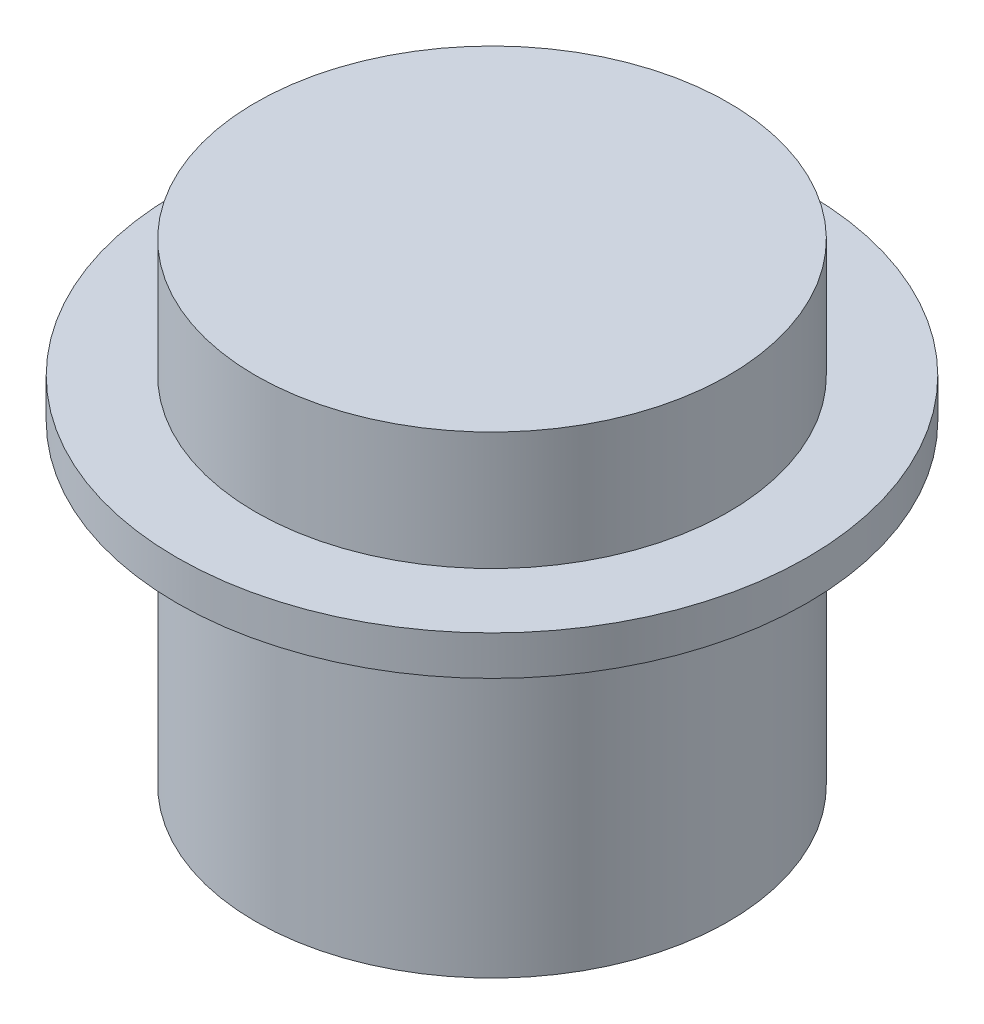
ISO-10303-21;
HEADER;
FILE_DESCRIPTION(('STEP AP214'),'2;1');
FILE_NAME('part.step','',(''),(''),'','','');
FILE_SCHEMA(('AUTOMOTIVE_DESIGN { 1 0 10303 214 1 1 1 1 }'));
ENDSEC;
DATA;
#1=APPLICATION_CONTEXT('core data for automotive mechanical design processes');
#2=APPLICATION_PROTOCOL_DEFINITION('international standard','automotive_design',2000,#1);
#3=PRODUCT_CONTEXT('',#1,'mechanical');
#4=PRODUCT('Part','Part','',(#3));
#5=PRODUCT_RELATED_PRODUCT_CATEGORY('part','',(#4));
#6=PRODUCT_DEFINITION_FORMATION('','',#4);
#7=PRODUCT_DEFINITION_CONTEXT('part definition',#1,'design');
#8=PRODUCT_DEFINITION('design','',#6,#7);
#9=PRODUCT_DEFINITION_SHAPE('','',#8);
#10=(LENGTH_UNIT() NAMED_UNIT(*) SI_UNIT(.MILLI.,.METRE.));
#11=(NAMED_UNIT(*) PLANE_ANGLE_UNIT() SI_UNIT($,.RADIAN.));
#12=(NAMED_UNIT(*) SI_UNIT($,.STERADIAN.) SOLID_ANGLE_UNIT());
#13=UNCERTAINTY_MEASURE_WITH_UNIT(LENGTH_MEASURE(1.E-05),#10,'distance_accuracy_value','');
#14=(GEOMETRIC_REPRESENTATION_CONTEXT(3) GLOBAL_UNCERTAINTY_ASSIGNED_CONTEXT((#13)) GLOBAL_UNIT_ASSIGNED_CONTEXT((#10,
#11,#12)) REPRESENTATION_CONTEXT('',''));
#15=CARTESIAN_POINT('',(0.,0.,0.));
#16=DIRECTION('',(0.,0.,1.));
#17=DIRECTION('',(1.,0.,0.));
#18=AXIS2_PLACEMENT_3D('',#15,#16,#17);
#19=CARTESIAN_POINT('',(0.,-50.8,0.));
#20=DIRECTION('',(0.,1.,0.));
#21=DIRECTION('',(0.,0.,1.));
#22=AXIS2_PLACEMENT_3D('',#19,#20,#21);
#23=CYLINDRICAL_SURFACE('',#22,38.1);
#24=CARTESIAN_POINT('',(0.,6.35,0.));
#25=DIRECTION('',(0.,1.,0.));
#26=DIRECTION('',(0.,0.,1.));
#27=AXIS2_PLACEMENT_3D('',#24,#25,#26);
#28=CIRCLE('',#27,38.1);
#29=CARTESIAN_POINT('',(0.,6.35,38.1));
#30=VERTEX_POINT('',#29);
#31=EDGE_CURVE('E10',#30,#30,#28,.F.);
#32=ORIENTED_EDGE('',*,*,#31,.F.);
#33=EDGE_LOOP('',(#32));
#34=FACE_BOUND('',#33,.T.);
#35=CARTESIAN_POINT('',(0.,25.4,0.));
#36=DIRECTION('',(0.,1.,0.));
#37=DIRECTION('',(0.,0.,1.));
#38=AXIS2_PLACEMENT_3D('',#35,#36,#37);
#39=CIRCLE('',#38,38.1);
#40=CARTESIAN_POINT('',(0.,25.4,38.1));
#41=VERTEX_POINT('',#40);
#42=EDGE_CURVE('E55',#41,#41,#39,.T.);
#43=ORIENTED_EDGE('',*,*,#42,.F.);
#44=EDGE_LOOP('',(#43));
#45=FACE_BOUND('',#44,.T.);
#46=ADVANCED_FACE('F43',(#34,#45),#23,.T.);
#47=CARTESIAN_POINT('',(0.,25.4,0.));
#48=DIRECTION('',(0.,1.,0.));
#49=DIRECTION('',(0.,0.,1.));
#50=AXIS2_PLACEMENT_3D('',#47,#48,#49);
#51=PLANE('',#50);
#52=ORIENTED_EDGE('',*,*,#42,.T.);
#53=EDGE_LOOP('',(#52));
#54=FACE_BOUND('',#53,.T.);
#55=ADVANCED_FACE('F87',(#54),#51,.T.);
#56=CARTESIAN_POINT('',(0.,6.35,0.));
#57=DIRECTION('',(0.,1.,0.));
#58=DIRECTION('',(0.,0.,1.));
#59=AXIS2_PLACEMENT_3D('',#56,#57,#58);
#60=PLANE('',#59);
#61=CARTESIAN_POINT('',(0.,6.35,0.));
#62=DIRECTION('',(0.,1.,0.));
#63=DIRECTION('',(0.,0.,1.));
#64=AXIS2_PLACEMENT_3D('',#61,#62,#63);
#65=CIRCLE('',#64,50.8);
#66=CARTESIAN_POINT('',(0.,6.35,50.8));
#67=VERTEX_POINT('',#66);
#68=EDGE_CURVE('E60',#67,#67,#65,.T.);
#69=ORIENTED_EDGE('',*,*,#68,.T.);
#70=EDGE_LOOP('',(#69));
#71=FACE_BOUND('',#70,.T.);
#72=ORIENTED_EDGE('',*,*,#31,.T.);
#73=EDGE_LOOP('',(#72));
#74=FACE_BOUND('',#73,.T.);
#75=ADVANCED_FACE('F93',(#71,#74),#60,.T.);
#76=CARTESIAN_POINT('',(0.,0.,0.));
#77=DIRECTION('',(0.,1.,0.));
#78=DIRECTION('',(0.,0.,1.));
#79=AXIS2_PLACEMENT_3D('',#76,#77,#78);
#80=PLANE('',#79);
#81=CARTESIAN_POINT('',(0.,0.,0.));
#82=DIRECTION('',(0.,1.,0.));
#83=DIRECTION('',(0.,0.,1.));
#84=AXIS2_PLACEMENT_3D('',#81,#82,#83);
#85=CIRCLE('',#84,50.8);
#86=CARTESIAN_POINT('',(0.,0.,50.8));
#87=VERTEX_POINT('',#86);
#88=EDGE_CURVE('E63',#87,#87,#85,.T.);
#89=ORIENTED_EDGE('',*,*,#88,.F.);
#90=EDGE_LOOP('',(#89));
#91=FACE_BOUND('',#90,.T.);
#92=CARTESIAN_POINT('',(0.,0.,0.));
#93=DIRECTION('',(0.,1.,0.));
#94=DIRECTION('',(0.,0.,1.));
#95=AXIS2_PLACEMENT_3D('',#92,#93,#94);
#96=CIRCLE('',#95,38.1);
#97=CARTESIAN_POINT('',(0.,0.,38.1));
#98=VERTEX_POINT('',#97);
#99=EDGE_CURVE('E67',#98,#98,#96,.T.);
#100=ORIENTED_EDGE('',*,*,#99,.T.);
#101=EDGE_LOOP('',(#100));
#102=FACE_BOUND('',#101,.T.);
#103=ADVANCED_FACE('F75',(#91,#102),#80,.F.);
#104=CARTESIAN_POINT('',(0.,6.35,0.));
#105=DIRECTION('',(0.,-1.,0.));
#106=DIRECTION('',(0.,0.,-1.));
#107=AXIS2_PLACEMENT_3D('',#104,#105,#106);
#108=CYLINDRICAL_SURFACE('',#107,50.8);
#109=ORIENTED_EDGE('',*,*,#68,.F.);
#110=EDGE_LOOP('',(#109));
#111=FACE_BOUND('',#110,.T.);
#112=ORIENTED_EDGE('',*,*,#88,.T.);
#113=EDGE_LOOP('',(#112));
#114=FACE_BOUND('',#113,.T.);
#115=ADVANCED_FACE('F84',(#111,#114),#108,.T.);
#116=CARTESIAN_POINT('',(0.,-50.8,0.));
#117=DIRECTION('',(0.,1.,0.));
#118=DIRECTION('',(0.,0.,1.));
#119=AXIS2_PLACEMENT_3D('',#116,#117,#118);
#120=PLANE('',#119);
#121=CARTESIAN_POINT('',(0.,-50.8,0.));
#122=DIRECTION('',(0.,1.,0.));
#123=DIRECTION('',(0.,0.,1.));
#124=AXIS2_PLACEMENT_3D('',#121,#122,#123);
#125=CIRCLE('',#124,38.1);
#126=CARTESIAN_POINT('',(0.,-50.8,38.1));
#127=VERTEX_POINT('',#126);
#128=EDGE_CURVE('E50',#127,#127,#125,.T.);
#129=ORIENTED_EDGE('',*,*,#128,.F.);
#130=EDGE_LOOP('',(#129));
#131=FACE_BOUND('',#130,.T.);
#132=ADVANCED_FACE('F79',(#131),#120,.F.);
#133=ORIENTED_EDGE('',*,*,#128,.T.);
#134=EDGE_LOOP('',(#133));
#135=FACE_BOUND('',#134,.T.);
#136=ORIENTED_EDGE('',*,*,#99,.F.);
#137=EDGE_LOOP('',(#136));
#138=FACE_BOUND('',#137,.T.);
#139=ADVANCED_FACE('F77',(#135,#138),#23,.T.);
#140=CLOSED_SHELL('',(#46,#55,#75,#103,#115,#132,#139));
#141=MANIFOLD_SOLID_BREP('B2',#140);
#142=ADVANCED_BREP_SHAPE_REPRESENTATION('',(#18,#141),#14);
#143=SHAPE_DEFINITION_REPRESENTATION(#9,#142);
ENDSEC;
END-ISO-10303-21;
